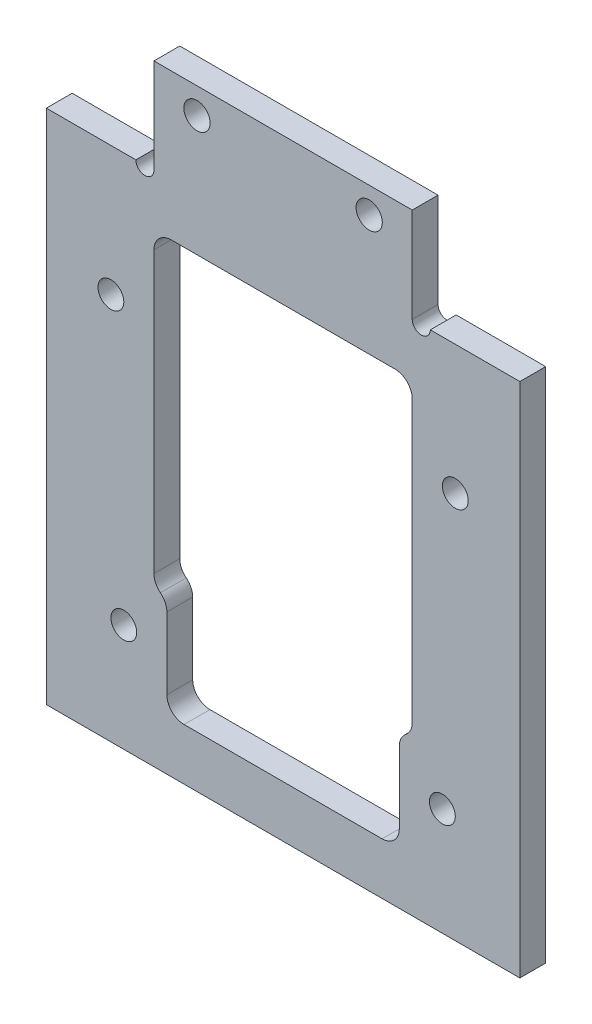
ISO-10303-21;
HEADER;
FILE_DESCRIPTION(('STEP AP214'),'2;1');
FILE_NAME('part.step','',(''),(''),'','','');
FILE_SCHEMA(('AUTOMOTIVE_DESIGN { 1 0 10303 214 1 1 1 1 }'));
ENDSEC;
DATA;
#1=APPLICATION_CONTEXT('core data for automotive mechanical design processes');
#2=APPLICATION_PROTOCOL_DEFINITION('international standard','automotive_design',2000,#1);
#3=PRODUCT_CONTEXT('',#1,'mechanical');
#4=PRODUCT('Part','Part','',(#3));
#5=PRODUCT_RELATED_PRODUCT_CATEGORY('part','',(#4));
#6=PRODUCT_DEFINITION_FORMATION('','',#4);
#7=PRODUCT_DEFINITION_CONTEXT('part definition',#1,'design');
#8=PRODUCT_DEFINITION('design','',#6,#7);
#9=PRODUCT_DEFINITION_SHAPE('','',#8);
#10=(LENGTH_UNIT() NAMED_UNIT(*) SI_UNIT(.MILLI.,.METRE.));
#11=(NAMED_UNIT(*) PLANE_ANGLE_UNIT() SI_UNIT($,.RADIAN.));
#12=(NAMED_UNIT(*) SI_UNIT($,.STERADIAN.) SOLID_ANGLE_UNIT());
#13=UNCERTAINTY_MEASURE_WITH_UNIT(LENGTH_MEASURE(1.E-05),#10,'distance_accuracy_value','');
#14=(GEOMETRIC_REPRESENTATION_CONTEXT(3) GLOBAL_UNCERTAINTY_ASSIGNED_CONTEXT((#13)) GLOBAL_UNIT_ASSIGNED_CONTEXT((#10,
#11,#12)) REPRESENTATION_CONTEXT('',''));
#15=CARTESIAN_POINT('',(0.,0.,0.));
#16=DIRECTION('',(0.,0.,1.));
#17=DIRECTION('',(1.,0.,0.));
#18=AXIS2_PLACEMENT_3D('',#15,#16,#17);
#19=CARTESIAN_POINT('',(-27.5,30.,3.));
#20=DIRECTION('',(0.,-1.,0.));
#21=DIRECTION('',(0.,0.,-1.));
#22=AXIS2_PLACEMENT_3D('',#19,#20,#21);
#23=PLANE('',#22);
#24=DIRECTION('',(-1.,0.,0.));
#25=VECTOR('',#24,1.);
#26=CARTESIAN_POINT('',(-27.5,30.,3.));
#27=LINE('',#26,#25);
#28=CARTESIAN_POINT('',(-17.1,30.,3.));
#29=VERTEX_POINT('',#28);
#30=CARTESIAN_POINT('',(-27.5,30.,3.));
#31=VERTEX_POINT('',#30);
#32=EDGE_CURVE('E244',#29,#31,#27,.T.);
#33=ORIENTED_EDGE('',*,*,#32,.F.);
#34=DIRECTION('',(0.,0.,-1.));
#35=VECTOR('',#34,1.);
#36=CARTESIAN_POINT('',(-17.1,30.,5.9698484809835));
#37=LINE('',#36,#35);
#38=CARTESIAN_POINT('',(-17.1,30.,0.));
#39=VERTEX_POINT('',#38);
#40=EDGE_CURVE('E227',#29,#39,#37,.T.);
#41=ORIENTED_EDGE('',*,*,#40,.T.);
#42=DIRECTION('',(-1.,0.,0.));
#43=VECTOR('',#42,1.);
#44=CARTESIAN_POINT('',(-27.5,30.,0.));
#45=LINE('',#44,#43);
#46=CARTESIAN_POINT('',(-27.5,30.,0.));
#47=VERTEX_POINT('',#46);
#48=EDGE_CURVE('E254',#39,#47,#45,.T.);
#49=ORIENTED_EDGE('',*,*,#48,.T.);
#50=DIRECTION('',(0.,0.,-1.));
#51=VECTOR('',#50,1.);
#52=CARTESIAN_POINT('',(-27.5,30.,3.));
#53=LINE('',#52,#51);
#54=EDGE_CURVE('E266',#31,#47,#53,.T.);
#55=ORIENTED_EDGE('',*,*,#54,.F.);
#56=EDGE_LOOP('',(#33,#41,#49,#55));
#57=FACE_BOUND('',#56,.T.);
#58=ADVANCED_FACE('F35',(#57),#23,.F.);
#59=CARTESIAN_POINT('',(27.5,-30.,3.));
#60=DIRECTION('',(-1.,0.,0.));
#61=DIRECTION('',(0.,0.,1.));
#62=AXIS2_PLACEMENT_3D('',#59,#60,#61);
#63=PLANE('',#62);
#64=DIRECTION('',(0.,1.,0.));
#65=VECTOR('',#64,1.);
#66=CARTESIAN_POINT('',(27.5,-30.,0.));
#67=LINE('',#66,#65);
#68=CARTESIAN_POINT('',(27.5,-30.,0.));
#69=VERTEX_POINT('',#68);
#70=CARTESIAN_POINT('',(27.5,30.,0.));
#71=VERTEX_POINT('',#70);
#72=EDGE_CURVE('E241',#69,#71,#67,.T.);
#73=ORIENTED_EDGE('',*,*,#72,.T.);
#74=DIRECTION('',(0.,0.,-1.));
#75=VECTOR('',#74,1.);
#76=CARTESIAN_POINT('',(27.5,30.,3.));
#77=LINE('',#76,#75);
#78=CARTESIAN_POINT('',(27.5,30.,3.));
#79=VERTEX_POINT('',#78);
#80=EDGE_CURVE('E269',#79,#71,#77,.T.);
#81=ORIENTED_EDGE('',*,*,#80,.F.);
#82=DIRECTION('',(0.,1.,0.));
#83=VECTOR('',#82,1.);
#84=CARTESIAN_POINT('',(27.5,-30.,3.));
#85=LINE('',#84,#83);
#86=CARTESIAN_POINT('',(27.5,-30.,3.));
#87=VERTEX_POINT('',#86);
#88=EDGE_CURVE('E242',#87,#79,#85,.T.);
#89=ORIENTED_EDGE('',*,*,#88,.F.);
#90=DIRECTION('',(0.,0.,-1.));
#91=VECTOR('',#90,1.);
#92=CARTESIAN_POINT('',(27.5,-30.,3.));
#93=LINE('',#92,#91);
#94=EDGE_CURVE('E251',#87,#69,#93,.T.);
#95=ORIENTED_EDGE('',*,*,#94,.T.);
#96=EDGE_LOOP('',(#73,#81,#89,#95));
#97=FACE_BOUND('',#96,.T.);
#98=ADVANCED_FACE('F462',(#97),#63,.F.);
#99=CARTESIAN_POINT('',(17.1,30.,0.));
#100=VERTEX_POINT('',#99);
#101=EDGE_CURVE('E255',#71,#100,#45,.T.);
#102=ORIENTED_EDGE('',*,*,#101,.T.);
#103=DIRECTION('',(0.,0.,-1.));
#104=VECTOR('',#103,1.);
#105=CARTESIAN_POINT('',(17.1,30.,5.9698484809835));
#106=LINE('',#105,#104);
#107=CARTESIAN_POINT('',(17.1,30.,3.));
#108=VERTEX_POINT('',#107);
#109=EDGE_CURVE('E215',#100,#108,#106,.F.);
#110=ORIENTED_EDGE('',*,*,#109,.T.);
#111=EDGE_CURVE('E214',#79,#108,#27,.T.);
#112=ORIENTED_EDGE('',*,*,#111,.F.);
#113=ORIENTED_EDGE('',*,*,#80,.T.);
#114=EDGE_LOOP('',(#102,#110,#112,#113));
#115=FACE_BOUND('',#114,.T.);
#116=ADVANCED_FACE('F464',(#115),#23,.F.);
#117=CARTESIAN_POINT('',(-27.5,-30.,3.));
#118=DIRECTION('',(1.,0.,0.));
#119=DIRECTION('',(0.,0.,-1.));
#120=AXIS2_PLACEMENT_3D('',#117,#118,#119);
#121=PLANE('',#120);
#122=DIRECTION('',(0.,-1.,0.));
#123=VECTOR('',#122,1.);
#124=CARTESIAN_POINT('',(-27.5,-30.,0.));
#125=LINE('',#124,#123);
#126=CARTESIAN_POINT('',(-27.5,-30.,0.));
#127=VERTEX_POINT('',#126);
#128=EDGE_CURVE('E258',#47,#127,#125,.T.);
#129=ORIENTED_EDGE('',*,*,#128,.T.);
#130=DIRECTION('',(0.,0.,-1.));
#131=VECTOR('',#130,1.);
#132=CARTESIAN_POINT('',(-27.5,-30.,3.));
#133=LINE('',#132,#131);
#134=CARTESIAN_POINT('',(-27.5,-30.,3.));
#135=VERTEX_POINT('',#134);
#136=EDGE_CURVE('E263',#135,#127,#133,.T.);
#137=ORIENTED_EDGE('',*,*,#136,.F.);
#138=DIRECTION('',(0.,-1.,0.));
#139=VECTOR('',#138,1.);
#140=CARTESIAN_POINT('',(-27.5,-30.,3.));
#141=LINE('',#140,#139);
#142=EDGE_CURVE('E247',#31,#135,#141,.T.);
#143=ORIENTED_EDGE('',*,*,#142,.F.);
#144=ORIENTED_EDGE('',*,*,#54,.T.);
#145=EDGE_LOOP('',(#129,#137,#143,#144));
#146=FACE_BOUND('',#145,.T.);
#147=ADVANCED_FACE('F435',(#146),#121,.F.);
#148=CARTESIAN_POINT('',(-27.5,-30.,3.));
#149=DIRECTION('',(0.,1.,0.));
#150=DIRECTION('',(0.,0.,1.));
#151=AXIS2_PLACEMENT_3D('',#148,#149,#150);
#152=PLANE('',#151);
#153=DIRECTION('',(1.,0.,0.));
#154=VECTOR('',#153,1.);
#155=CARTESIAN_POINT('',(-27.5,-30.,0.));
#156=LINE('',#155,#154);
#157=EDGE_CURVE('E245',#127,#69,#156,.T.);
#158=ORIENTED_EDGE('',*,*,#157,.T.);
#159=ORIENTED_EDGE('',*,*,#94,.F.);
#160=DIRECTION('',(1.,0.,0.));
#161=VECTOR('',#160,1.);
#162=CARTESIAN_POINT('',(-27.5,-30.,3.));
#163=LINE('',#162,#161);
#164=EDGE_CURVE('E249',#135,#87,#163,.T.);
#165=ORIENTED_EDGE('',*,*,#164,.F.);
#166=ORIENTED_EDGE('',*,*,#136,.T.);
#167=EDGE_LOOP('',(#158,#159,#165,#166));
#168=FACE_BOUND('',#167,.T.);
#169=ADVANCED_FACE('F439',(#168),#152,.F.);
#170=CARTESIAN_POINT('',(0.,0.,3.));
#171=DIRECTION('',(0.,0.,-1.));
#172=DIRECTION('',(-1.,0.,0.));
#173=AXIS2_PLACEMENT_3D('',#170,#171,#172);
#174=PLANE('',#173);
#175=DIRECTION('',(0.,-1.,0.));
#176=VECTOR('',#175,1.);
#177=CARTESIAN_POINT('',(-13.5,-24.,3.));
#178=LINE('',#177,#176);
#179=CARTESIAN_POINT('',(-13.5,-13.6860073260955,3.));
#180=VERTEX_POINT('',#179);
#181=CARTESIAN_POINT('',(-13.5,-22.,3.));
#182=VERTEX_POINT('',#181);
#183=EDGE_CURVE('E718',#180,#182,#178,.T.);
#184=ORIENTED_EDGE('',*,*,#183,.F.);
#185=CARTESIAN_POINT('',(-15.5,-13.6860073260955,3.));
#186=DIRECTION('',(0.,0.,-1.));
#187=DIRECTION('',(-1.,0.,0.));
#188=AXIS2_PLACEMENT_3D('',#185,#186,#187);
#189=CIRCLE('',#188,2.);
#190=CARTESIAN_POINT('',(-14.25,-12.1247578264959,3.));
#191=VERTEX_POINT('',#190);
#192=EDGE_CURVE('E355',#180,#191,#189,.F.);
#193=ORIENTED_EDGE('',*,*,#192,.T.);
#194=CARTESIAN_POINT('',(-13.0000000000001,-10.5635083268963,3.));
#195=DIRECTION('',(0.,0.,-1.));
#196=DIRECTION('',(-1.,0.,0.));
#197=AXIS2_PLACEMENT_3D('',#194,#195,#196);
#198=CIRCLE('',#197,2.);
#199=CARTESIAN_POINT('',(-15.0000000000001,-10.5635083268963,3.));
#200=VERTEX_POINT('',#199);
#201=EDGE_CURVE('E335',#191,#200,#198,.T.);
#202=ORIENTED_EDGE('',*,*,#201,.T.);
#203=DIRECTION('',(0.,-1.,0.));
#204=VECTOR('',#203,1.);
#205=CARTESIAN_POINT('',(-15.0000000000001,-12.5,3.));
#206=LINE('',#205,#204);
#207=CARTESIAN_POINT('',(-15.0000000000001,22.,3.));
#208=VERTEX_POINT('',#207);
#209=EDGE_CURVE('E726',#208,#200,#206,.T.);
#210=ORIENTED_EDGE('',*,*,#209,.F.);
#211=CARTESIAN_POINT('',(-13.0000000000001,22.,3.));
#212=DIRECTION('',(0.,0.,-1.));
#213=DIRECTION('',(-1.,0.,0.));
#214=AXIS2_PLACEMENT_3D('',#211,#212,#213);
#215=CIRCLE('',#214,2.);
#216=CARTESIAN_POINT('',(-13.0000000000001,24.,3.));
#217=VERTEX_POINT('',#216);
#218=EDGE_CURVE('E322',#208,#217,#215,.T.);
#219=ORIENTED_EDGE('',*,*,#218,.T.);
#220=DIRECTION('',(-1.,0.,0.));
#221=VECTOR('',#220,1.);
#222=CARTESIAN_POINT('',(-15.0000000000001,24.,3.));
#223=LINE('',#222,#221);
#224=CARTESIAN_POINT('',(12.9999999999999,24.,3.));
#225=VERTEX_POINT('',#224);
#226=EDGE_CURVE('E377',#225,#217,#223,.T.);
#227=ORIENTED_EDGE('',*,*,#226,.F.);
#228=CARTESIAN_POINT('',(12.9999999999999,22.,3.));
#229=DIRECTION('',(0.,0.,-1.));
#230=DIRECTION('',(-1.,0.,0.));
#231=AXIS2_PLACEMENT_3D('',#228,#229,#230);
#232=CIRCLE('',#231,2.);
#233=CARTESIAN_POINT('',(14.9999999999999,22.,3.));
#234=VERTEX_POINT('',#233);
#235=EDGE_CURVE('E326',#225,#234,#232,.T.);
#236=ORIENTED_EDGE('',*,*,#235,.T.);
#237=DIRECTION('',(0.,1.,0.));
#238=VECTOR('',#237,1.);
#239=CARTESIAN_POINT('',(14.9999999999999,24.,3.));
#240=LINE('',#239,#238);
#241=CARTESIAN_POINT('',(14.9999999999999,-10.5635083268963,3.));
#242=VERTEX_POINT('',#241);
#243=EDGE_CURVE('E373',#242,#234,#240,.T.);
#244=ORIENTED_EDGE('',*,*,#243,.F.);
#245=CARTESIAN_POINT('',(12.9999999999999,-10.5635083268963,3.));
#246=DIRECTION('',(0.,0.,-1.));
#247=DIRECTION('',(-1.,0.,0.));
#248=AXIS2_PLACEMENT_3D('',#245,#246,#247);
#249=CIRCLE('',#248,2.);
#250=CARTESIAN_POINT('',(14.25,-12.1247578264959,3.));
#251=VERTEX_POINT('',#250);
#252=EDGE_CURVE('E330',#242,#251,#249,.T.);
#253=ORIENTED_EDGE('',*,*,#252,.T.);
#254=CARTESIAN_POINT('',(15.5,-13.6860073260955,3.));
#255=DIRECTION('',(0.,0.,-1.));
#256=DIRECTION('',(-1.,0.,0.));
#257=AXIS2_PLACEMENT_3D('',#254,#255,#256);
#258=CIRCLE('',#257,2.);
#259=CARTESIAN_POINT('',(13.5,-13.6860073260955,3.));
#260=VERTEX_POINT('',#259);
#261=EDGE_CURVE('E353',#251,#260,#258,.F.);
#262=ORIENTED_EDGE('',*,*,#261,.T.);
#263=DIRECTION('',(0.,1.,0.));
#264=VECTOR('',#263,1.);
#265=CARTESIAN_POINT('',(13.5,-12.5,3.));
#266=LINE('',#265,#264);
#267=CARTESIAN_POINT('',(13.5,-22.,3.));
#268=VERTEX_POINT('',#267);
#269=EDGE_CURVE('E378',#268,#260,#266,.T.);
#270=ORIENTED_EDGE('',*,*,#269,.F.);
#271=CARTESIAN_POINT('',(11.5,-22.,3.));
#272=DIRECTION('',(0.,0.,-1.));
#273=DIRECTION('',(-1.,0.,0.));
#274=AXIS2_PLACEMENT_3D('',#271,#272,#273);
#275=CIRCLE('',#274,2.);
#276=CARTESIAN_POINT('',(11.5,-24.,3.));
#277=VERTEX_POINT('',#276);
#278=EDGE_CURVE('E345',#268,#277,#275,.T.);
#279=ORIENTED_EDGE('',*,*,#278,.T.);
#280=DIRECTION('',(1.,0.,0.));
#281=VECTOR('',#280,1.);
#282=CARTESIAN_POINT('',(13.5,-24.,3.));
#283=LINE('',#282,#281);
#284=CARTESIAN_POINT('',(-11.5,-24.,3.));
#285=VERTEX_POINT('',#284);
#286=EDGE_CURVE('E383',#285,#277,#283,.T.);
#287=ORIENTED_EDGE('',*,*,#286,.F.);
#288=CARTESIAN_POINT('',(-11.5,-22.,3.));
#289=DIRECTION('',(0.,0.,-1.));
#290=DIRECTION('',(-1.,0.,0.));
#291=AXIS2_PLACEMENT_3D('',#288,#289,#290);
#292=CIRCLE('',#291,2.);
#293=EDGE_CURVE('E340',#285,#182,#292,.T.);
#294=ORIENTED_EDGE('',*,*,#293,.T.);
#295=EDGE_LOOP('',(#184,#193,#202,#210,#219,#227,#236,#244,#253,#262,#270,#279,#287,#294));
#296=FACE_BOUND('',#295,.T.);
#297=CARTESIAN_POINT('',(19.9999999999999,15.,3.));
#298=DIRECTION('',(0.,0.,1.));
#299=DIRECTION('',(1.,0.,0.));
#300=AXIS2_PLACEMENT_3D('',#297,#298,#299);
#301=CIRCLE('',#300,1.5);
#302=CARTESIAN_POINT('',(21.4999999999999,15.,3.));
#303=VERTEX_POINT('',#302);
#304=EDGE_CURVE('E277',#303,#303,#301,.T.);
#305=ORIENTED_EDGE('',*,*,#304,.F.);
#306=EDGE_LOOP('',(#305));
#307=FACE_BOUND('',#306,.T.);
#308=CARTESIAN_POINT('',(-20.0000000000001,15.,3.));
#309=DIRECTION('',(0.,0.,1.));
#310=DIRECTION('',(1.,0.,0.));
#311=AXIS2_PLACEMENT_3D('',#308,#309,#310);
#312=CIRCLE('',#311,1.5);
#313=CARTESIAN_POINT('',(-18.5000000000001,15.,3.));
#314=VERTEX_POINT('',#313);
#315=EDGE_CURVE('E381',#314,#314,#312,.T.);
#316=ORIENTED_EDGE('',*,*,#315,.F.);
#317=EDGE_LOOP('',(#316));
#318=FACE_BOUND('',#317,.T.);
#319=CARTESIAN_POINT('',(18.5,-17.5,3.));
#320=DIRECTION('',(0.,0.,-1.));
#321=DIRECTION('',(-1.,0.,0.));
#322=AXIS2_PLACEMENT_3D('',#319,#320,#321);
#323=CIRCLE('',#322,1.5);
#324=CARTESIAN_POINT('',(17.,-17.5,3.));
#325=VERTEX_POINT('',#324);
#326=EDGE_CURVE('E399',#325,#325,#323,.T.);
#327=ORIENTED_EDGE('',*,*,#326,.T.);
#328=EDGE_LOOP('',(#327));
#329=FACE_BOUND('',#328,.T.);
#330=CARTESIAN_POINT('',(-18.5,-17.5,3.));
#331=DIRECTION('',(0.,0.,-1.));
#332=DIRECTION('',(-1.,0.,0.));
#333=AXIS2_PLACEMENT_3D('',#330,#331,#332);
#334=CIRCLE('',#333,1.5);
#335=CARTESIAN_POINT('',(-20.,-17.5,3.));
#336=VERTEX_POINT('',#335);
#337=EDGE_CURVE('E394',#336,#336,#334,.T.);
#338=ORIENTED_EDGE('',*,*,#337,.T.);
#339=EDGE_LOOP('',(#338));
#340=FACE_BOUND('',#339,.T.);
#341=CARTESIAN_POINT('',(-10.,38.,3.));
#342=DIRECTION('',(0.,0.,1.));
#343=DIRECTION('',(1.,0.,0.));
#344=AXIS2_PLACEMENT_3D('',#341,#342,#343);
#345=CIRCLE('',#344,1.525);
#346=CARTESIAN_POINT('',(-8.475,38.,3.));
#347=VERTEX_POINT('',#346);
#348=EDGE_CURVE('E403',#347,#347,#345,.T.);
#349=ORIENTED_EDGE('',*,*,#348,.F.);
#350=EDGE_LOOP('',(#349));
#351=FACE_BOUND('',#350,.T.);
#352=CARTESIAN_POINT('',(10.,38.,3.));
#353=DIRECTION('',(0.,0.,1.));
#354=DIRECTION('',(1.,0.,0.));
#355=AXIS2_PLACEMENT_3D('',#352,#353,#354);
#356=CIRCLE('',#355,1.525);
#357=CARTESIAN_POINT('',(11.525,38.,3.));
#358=VERTEX_POINT('',#357);
#359=EDGE_CURVE('E402',#358,#358,#356,.T.);
#360=ORIENTED_EDGE('',*,*,#359,.F.);
#361=EDGE_LOOP('',(#360));
#362=FACE_BOUND('',#361,.T.);
#363=ORIENTED_EDGE('',*,*,#111,.T.);
#364=CARTESIAN_POINT('',(16.05,30.,3.));
#365=DIRECTION('',(0.,0.,-1.));
#366=DIRECTION('',(-1.,0.,0.));
#367=AXIS2_PLACEMENT_3D('',#364,#365,#366);
#368=CIRCLE('',#367,1.05);
#369=CARTESIAN_POINT('',(15.,30.,3.));
#370=VERTEX_POINT('',#369);
#371=EDGE_CURVE('E197',#370,#108,#368,.F.);
#372=ORIENTED_EDGE('',*,*,#371,.F.);
#373=DIRECTION('',(0.,1.,0.));
#374=VECTOR('',#373,1.);
#375=CARTESIAN_POINT('',(15.,19.,3.));
#376=LINE('',#375,#374);
#377=CARTESIAN_POINT('',(15.,41.,3.));
#378=VERTEX_POINT('',#377);
#379=EDGE_CURVE('E211',#370,#378,#376,.T.);
#380=ORIENTED_EDGE('',*,*,#379,.T.);
#381=DIRECTION('',(-1.,0.,0.));
#382=VECTOR('',#381,1.);
#383=CARTESIAN_POINT('',(15.,41.,3.));
#384=LINE('',#383,#382);
#385=CARTESIAN_POINT('',(-15.,41.,3.));
#386=VERTEX_POINT('',#385);
#387=EDGE_CURVE('E206',#378,#386,#384,.T.);
#388=ORIENTED_EDGE('',*,*,#387,.T.);
#389=DIRECTION('',(0.,-1.,0.));
#390=VECTOR('',#389,1.);
#391=CARTESIAN_POINT('',(-15.,19.,3.));
#392=LINE('',#391,#390);
#393=CARTESIAN_POINT('',(-15.,30.,3.));
#394=VERTEX_POINT('',#393);
#395=EDGE_CURVE('E220',#386,#394,#392,.T.);
#396=ORIENTED_EDGE('',*,*,#395,.T.);
#397=CARTESIAN_POINT('',(-16.05,30.,3.));
#398=DIRECTION('',(0.,0.,-1.));
#399=DIRECTION('',(-1.,0.,0.));
#400=AXIS2_PLACEMENT_3D('',#397,#398,#399);
#401=CIRCLE('',#400,1.05);
#402=EDGE_CURVE('E415',#29,#394,#401,.F.);
#403=ORIENTED_EDGE('',*,*,#402,.F.);
#404=ORIENTED_EDGE('',*,*,#32,.T.);
#405=ORIENTED_EDGE('',*,*,#142,.T.);
#406=ORIENTED_EDGE('',*,*,#164,.T.);
#407=ORIENTED_EDGE('',*,*,#88,.T.);
#408=EDGE_LOOP('',(#363,#372,#380,#388,#396,#403,#404,#405,#406,#407));
#409=FACE_BOUND('',#408,.T.);
#410=ADVANCED_FACE('F210',(#296,#307,#318,#329,#340,#351,#362,#409),#174,.F.);
#411=CARTESIAN_POINT('',(0.,0.,0.));
#412=DIRECTION('',(0.,0.,-1.));
#413=DIRECTION('',(-1.,0.,0.));
#414=AXIS2_PLACEMENT_3D('',#411,#412,#413);
#415=PLANE('',#414);
#416=CARTESIAN_POINT('',(-13.0000000000001,-10.5635083268963,0.));
#417=DIRECTION('',(0.,0.,-1.));
#418=DIRECTION('',(-1.,0.,0.));
#419=AXIS2_PLACEMENT_3D('',#416,#417,#418);
#420=CIRCLE('',#419,2.);
#421=CARTESIAN_POINT('',(-15.0000000000001,-10.5635083268963,0.));
#422=VERTEX_POINT('',#421);
#423=CARTESIAN_POINT('',(-14.25,-12.1247578264959,0.));
#424=VERTEX_POINT('',#423);
#425=EDGE_CURVE('E337',#422,#424,#420,.F.);
#426=ORIENTED_EDGE('',*,*,#425,.T.);
#427=CARTESIAN_POINT('',(-15.5,-13.6860073260955,0.));
#428=DIRECTION('',(0.,0.,-1.));
#429=DIRECTION('',(-1.,0.,0.));
#430=AXIS2_PLACEMENT_3D('',#427,#428,#429);
#431=CIRCLE('',#430,2.);
#432=CARTESIAN_POINT('',(-13.5,-13.6860073260955,0.));
#433=VERTEX_POINT('',#432);
#434=EDGE_CURVE('E360',#424,#433,#431,.T.);
#435=ORIENTED_EDGE('',*,*,#434,.T.);
#436=DIRECTION('',(0.,1.,0.));
#437=VECTOR('',#436,1.);
#438=CARTESIAN_POINT('',(-13.5,0.,0.));
#439=LINE('',#438,#437);
#440=CARTESIAN_POINT('',(-13.5,-22.,0.));
#441=VERTEX_POINT('',#440);
#442=EDGE_CURVE('E272',#441,#433,#439,.T.);
#443=ORIENTED_EDGE('',*,*,#442,.F.);
#444=CARTESIAN_POINT('',(-11.5,-22.,0.));
#445=DIRECTION('',(0.,0.,-1.));
#446=DIRECTION('',(-1.,0.,0.));
#447=AXIS2_PLACEMENT_3D('',#444,#445,#446);
#448=CIRCLE('',#447,2.);
#449=CARTESIAN_POINT('',(-11.5,-24.,0.));
#450=VERTEX_POINT('',#449);
#451=EDGE_CURVE('E343',#441,#450,#448,.F.);
#452=ORIENTED_EDGE('',*,*,#451,.T.);
#453=DIRECTION('',(-1.,0.,0.));
#454=VECTOR('',#453,1.);
#455=CARTESIAN_POINT('',(0.,-24.,0.));
#456=LINE('',#455,#454);
#457=CARTESIAN_POINT('',(11.5,-24.,0.));
#458=VERTEX_POINT('',#457);
#459=EDGE_CURVE('E283',#458,#450,#456,.T.);
#460=ORIENTED_EDGE('',*,*,#459,.F.);
#461=CARTESIAN_POINT('',(11.5,-22.,0.));
#462=DIRECTION('',(0.,0.,-1.));
#463=DIRECTION('',(-1.,0.,0.));
#464=AXIS2_PLACEMENT_3D('',#461,#462,#463);
#465=CIRCLE('',#464,2.);
#466=CARTESIAN_POINT('',(13.5,-22.,0.));
#467=VERTEX_POINT('',#466);
#468=EDGE_CURVE('E347',#458,#467,#465,.F.);
#469=ORIENTED_EDGE('',*,*,#468,.T.);
#470=DIRECTION('',(0.,-1.,0.));
#471=VECTOR('',#470,1.);
#472=CARTESIAN_POINT('',(13.5,0.,0.));
#473=LINE('',#472,#471);
#474=CARTESIAN_POINT('',(13.5,-13.6860073260955,0.));
#475=VERTEX_POINT('',#474);
#476=EDGE_CURVE('E286',#475,#467,#473,.T.);
#477=ORIENTED_EDGE('',*,*,#476,.F.);
#478=CARTESIAN_POINT('',(15.5,-13.6860073260955,0.));
#479=DIRECTION('',(0.,0.,-1.));
#480=DIRECTION('',(-1.,0.,0.));
#481=AXIS2_PLACEMENT_3D('',#478,#479,#480);
#482=CIRCLE('',#481,2.);
#483=CARTESIAN_POINT('',(14.25,-12.1247578264959,0.));
#484=VERTEX_POINT('',#483);
#485=EDGE_CURVE('E50',#475,#484,#482,.T.);
#486=ORIENTED_EDGE('',*,*,#485,.T.);
#487=CARTESIAN_POINT('',(12.9999999999999,-10.5635083268963,0.));
#488=DIRECTION('',(0.,0.,-1.));
#489=DIRECTION('',(-1.,0.,0.));
#490=AXIS2_PLACEMENT_3D('',#487,#488,#489);
#491=CIRCLE('',#490,2.);
#492=CARTESIAN_POINT('',(14.9999999999999,-10.5635083268963,0.));
#493=VERTEX_POINT('',#492);
#494=EDGE_CURVE('E333',#484,#493,#491,.F.);
#495=ORIENTED_EDGE('',*,*,#494,.T.);
#496=DIRECTION('',(0.,-1.,0.));
#497=VECTOR('',#496,1.);
#498=CARTESIAN_POINT('',(14.9999999999999,0.,0.));
#499=LINE('',#498,#497);
#500=CARTESIAN_POINT('',(14.9999999999999,22.,0.));
#501=VERTEX_POINT('',#500);
#502=EDGE_CURVE('E288',#501,#493,#499,.T.);
#503=ORIENTED_EDGE('',*,*,#502,.F.);
#504=CARTESIAN_POINT('',(12.9999999999999,22.,0.));
#505=DIRECTION('',(0.,0.,-1.));
#506=DIRECTION('',(-1.,0.,0.));
#507=AXIS2_PLACEMENT_3D('',#504,#505,#506);
#508=CIRCLE('',#507,2.);
#509=CARTESIAN_POINT('',(12.9999999999999,24.,0.));
#510=VERTEX_POINT('',#509);
#511=EDGE_CURVE('E328',#501,#510,#508,.F.);
#512=ORIENTED_EDGE('',*,*,#511,.T.);
#513=DIRECTION('',(1.,0.,0.));
#514=VECTOR('',#513,1.);
#515=CARTESIAN_POINT('',(0.,24.,0.));
#516=LINE('',#515,#514);
#517=CARTESIAN_POINT('',(-13.0000000000001,24.,0.));
#518=VERTEX_POINT('',#517);
#519=EDGE_CURVE('E291',#518,#510,#516,.T.);
#520=ORIENTED_EDGE('',*,*,#519,.F.);
#521=CARTESIAN_POINT('',(-13.0000000000001,22.,0.));
#522=DIRECTION('',(0.,0.,-1.));
#523=DIRECTION('',(-1.,0.,0.));
#524=AXIS2_PLACEMENT_3D('',#521,#522,#523);
#525=CIRCLE('',#524,2.);
#526=CARTESIAN_POINT('',(-15.0000000000001,22.,0.));
#527=VERTEX_POINT('',#526);
#528=EDGE_CURVE('E324',#518,#527,#525,.F.);
#529=ORIENTED_EDGE('',*,*,#528,.T.);
#530=DIRECTION('',(0.,1.,0.));
#531=VECTOR('',#530,1.);
#532=CARTESIAN_POINT('',(-15.0000000000001,0.,0.));
#533=LINE('',#532,#531);
#534=EDGE_CURVE('E294',#422,#527,#533,.T.);
#535=ORIENTED_EDGE('',*,*,#534,.F.);
#536=EDGE_LOOP('',(#426,#435,#443,#452,#460,#469,#477,#486,#495,#503,#512,#520,#529,#535));
#537=FACE_BOUND('',#536,.T.);
#538=CARTESIAN_POINT('',(19.9999999999999,15.,0.));
#539=DIRECTION('',(0.,0.,-1.));
#540=DIRECTION('',(-1.,0.,0.));
#541=AXIS2_PLACEMENT_3D('',#538,#539,#540);
#542=CIRCLE('',#541,1.5);
#543=CARTESIAN_POINT('',(18.4999999999999,15.,0.));
#544=VERTEX_POINT('',#543);
#545=EDGE_CURVE('E276',#544,#544,#542,.T.);
#546=ORIENTED_EDGE('',*,*,#545,.F.);
#547=EDGE_LOOP('',(#546));
#548=FACE_BOUND('',#547,.T.);
#549=CARTESIAN_POINT('',(-20.0000000000001,15.,0.));
#550=DIRECTION('',(0.,0.,-1.));
#551=DIRECTION('',(-1.,0.,0.));
#552=AXIS2_PLACEMENT_3D('',#549,#550,#551);
#553=CIRCLE('',#552,1.5);
#554=CARTESIAN_POINT('',(-21.5000000000001,15.,0.));
#555=VERTEX_POINT('',#554);
#556=EDGE_CURVE('E273',#555,#555,#553,.T.);
#557=ORIENTED_EDGE('',*,*,#556,.F.);
#558=EDGE_LOOP('',(#557));
#559=FACE_BOUND('',#558,.T.);
#560=CARTESIAN_POINT('',(18.5,-17.5,0.));
#561=DIRECTION('',(0.,0.,-1.));
#562=DIRECTION('',(-1.,0.,0.));
#563=AXIS2_PLACEMENT_3D('',#560,#561,#562);
#564=CIRCLE('',#563,1.5);
#565=CARTESIAN_POINT('',(17.,-17.5,0.));
#566=VERTEX_POINT('',#565);
#567=EDGE_CURVE('E391',#566,#566,#564,.T.);
#568=ORIENTED_EDGE('',*,*,#567,.F.);
#569=EDGE_LOOP('',(#568));
#570=FACE_BOUND('',#569,.T.);
#571=CARTESIAN_POINT('',(-18.5,-17.5,0.));
#572=DIRECTION('',(0.,0.,-1.));
#573=DIRECTION('',(-1.,0.,0.));
#574=AXIS2_PLACEMENT_3D('',#571,#572,#573);
#575=CIRCLE('',#574,1.5);
#576=CARTESIAN_POINT('',(-20.,-17.5,0.));
#577=VERTEX_POINT('',#576);
#578=EDGE_CURVE('E280',#577,#577,#575,.T.);
#579=ORIENTED_EDGE('',*,*,#578,.F.);
#580=EDGE_LOOP('',(#579));
#581=FACE_BOUND('',#580,.T.);
#582=CARTESIAN_POINT('',(-10.,38.,0.));
#583=DIRECTION('',(0.,0.,-1.));
#584=DIRECTION('',(-1.,0.,0.));
#585=AXIS2_PLACEMENT_3D('',#582,#583,#584);
#586=CIRCLE('',#585,1.525);
#587=CARTESIAN_POINT('',(-11.525,38.,0.));
#588=VERTEX_POINT('',#587);
#589=EDGE_CURVE('E406',#588,#588,#586,.F.);
#590=ORIENTED_EDGE('',*,*,#589,.T.);
#591=EDGE_LOOP('',(#590));
#592=FACE_BOUND('',#591,.T.);
#593=CARTESIAN_POINT('',(10.,38.,0.));
#594=DIRECTION('',(0.,0.,-1.));
#595=DIRECTION('',(-1.,0.,0.));
#596=AXIS2_PLACEMENT_3D('',#593,#594,#595);
#597=CIRCLE('',#596,1.525);
#598=CARTESIAN_POINT('',(8.475,38.,0.));
#599=VERTEX_POINT('',#598);
#600=EDGE_CURVE('E407',#599,#599,#597,.F.);
#601=ORIENTED_EDGE('',*,*,#600,.T.);
#602=EDGE_LOOP('',(#601));
#603=FACE_BOUND('',#602,.T.);
#604=CARTESIAN_POINT('',(16.05,30.,0.));
#605=DIRECTION('',(0.,0.,-1.));
#606=DIRECTION('',(-1.,0.,0.));
#607=AXIS2_PLACEMENT_3D('',#604,#605,#606);
#608=CIRCLE('',#607,1.05);
#609=CARTESIAN_POINT('',(15.,30.,0.));
#610=VERTEX_POINT('',#609);
#611=EDGE_CURVE('E200',#100,#610,#608,.T.);
#612=ORIENTED_EDGE('',*,*,#611,.F.);
#613=ORIENTED_EDGE('',*,*,#101,.F.);
#614=ORIENTED_EDGE('',*,*,#72,.F.);
#615=ORIENTED_EDGE('',*,*,#157,.F.);
#616=ORIENTED_EDGE('',*,*,#128,.F.);
#617=ORIENTED_EDGE('',*,*,#48,.F.);
#618=CARTESIAN_POINT('',(-16.05,30.,0.));
#619=DIRECTION('',(0.,0.,-1.));
#620=DIRECTION('',(-1.,0.,0.));
#621=AXIS2_PLACEMENT_3D('',#618,#619,#620);
#622=CIRCLE('',#621,1.05);
#623=CARTESIAN_POINT('',(-15.,30.,0.));
#624=VERTEX_POINT('',#623);
#625=EDGE_CURVE('E410',#624,#39,#622,.T.);
#626=ORIENTED_EDGE('',*,*,#625,.F.);
#627=DIRECTION('',(0.,1.,0.));
#628=VECTOR('',#627,1.);
#629=CARTESIAN_POINT('',(-15.,19.,0.));
#630=LINE('',#629,#628);
#631=CARTESIAN_POINT('',(-15.,41.,0.));
#632=VERTEX_POINT('',#631);
#633=EDGE_CURVE('E230',#624,#632,#630,.T.);
#634=ORIENTED_EDGE('',*,*,#633,.T.);
#635=DIRECTION('',(1.,0.,0.));
#636=VECTOR('',#635,1.);
#637=CARTESIAN_POINT('',(15.,41.,0.));
#638=LINE('',#637,#636);
#639=CARTESIAN_POINT('',(15.,41.,0.));
#640=VERTEX_POINT('',#639);
#641=EDGE_CURVE('E232',#632,#640,#638,.T.);
#642=ORIENTED_EDGE('',*,*,#641,.T.);
#643=DIRECTION('',(0.,-1.,0.));
#644=VECTOR('',#643,1.);
#645=CARTESIAN_POINT('',(15.,19.,0.));
#646=LINE('',#645,#644);
#647=EDGE_CURVE('E235',#640,#610,#646,.T.);
#648=ORIENTED_EDGE('',*,*,#647,.T.);
#649=EDGE_LOOP('',(#612,#613,#614,#615,#616,#617,#626,#634,#642,#648));
#650=FACE_BOUND('',#649,.T.);
#651=ADVANCED_FACE('F429',(#537,#548,#559,#570,#581,#592,#603,#650),#415,.T.);
#652=CARTESIAN_POINT('',(-15.,19.,40.2021504754766));
#653=DIRECTION('',(-1.,0.,0.));
#654=DIRECTION('',(0.,0.,1.));
#655=AXIS2_PLACEMENT_3D('',#652,#653,#654);
#656=PLANE('',#655);
#657=DIRECTION('',(0.,0.,-1.));
#658=VECTOR('',#657,1.);
#659=CARTESIAN_POINT('',(-15.,30.,3.));
#660=LINE('',#659,#658);
#661=EDGE_CURVE('E205',#394,#624,#660,.T.);
#662=ORIENTED_EDGE('',*,*,#661,.F.);
#663=ORIENTED_EDGE('',*,*,#395,.F.);
#664=DIRECTION('',(0.,0.,-1.));
#665=VECTOR('',#664,1.);
#666=CARTESIAN_POINT('',(-15.,41.,40.2021504754766));
#667=LINE('',#666,#665);
#668=EDGE_CURVE('E224',#386,#632,#667,.T.);
#669=ORIENTED_EDGE('',*,*,#668,.T.);
#670=ORIENTED_EDGE('',*,*,#633,.F.);
#671=EDGE_LOOP('',(#662,#663,#669,#670));
#672=FACE_BOUND('',#671,.T.);
#673=ADVANCED_FACE('F447',(#672),#656,.T.);
#674=CARTESIAN_POINT('',(15.,19.,40.2021504754766));
#675=DIRECTION('',(1.,0.,0.));
#676=DIRECTION('',(0.,1.,0.));
#677=AXIS2_PLACEMENT_3D('',#674,#675,#676);
#678=PLANE('',#677);
#679=DIRECTION('',(0.,0.,1.));
#680=VECTOR('',#679,1.);
#681=CARTESIAN_POINT('',(15.,30.,3.));
#682=LINE('',#681,#680);
#683=EDGE_CURVE('E194',#610,#370,#682,.T.);
#684=ORIENTED_EDGE('',*,*,#683,.F.);
#685=ORIENTED_EDGE('',*,*,#647,.F.);
#686=DIRECTION('',(0.,0.,-1.));
#687=VECTOR('',#686,1.);
#688=CARTESIAN_POINT('',(15.,41.,40.2021504754766));
#689=LINE('',#688,#687);
#690=EDGE_CURVE('E218',#378,#640,#689,.T.);
#691=ORIENTED_EDGE('',*,*,#690,.F.);
#692=ORIENTED_EDGE('',*,*,#379,.F.);
#693=EDGE_LOOP('',(#684,#685,#691,#692));
#694=FACE_BOUND('',#693,.T.);
#695=ADVANCED_FACE('F217',(#694),#678,.T.);
#696=CARTESIAN_POINT('',(15.,41.,40.2021504754766));
#697=DIRECTION('',(0.,1.,0.));
#698=DIRECTION('',(-1.,0.,0.));
#699=AXIS2_PLACEMENT_3D('',#696,#697,#698);
#700=PLANE('',#699);
#701=ORIENTED_EDGE('',*,*,#387,.F.);
#702=ORIENTED_EDGE('',*,*,#690,.T.);
#703=ORIENTED_EDGE('',*,*,#641,.F.);
#704=ORIENTED_EDGE('',*,*,#668,.F.);
#705=EDGE_LOOP('',(#701,#702,#703,#704));
#706=FACE_BOUND('',#705,.T.);
#707=ADVANCED_FACE('F451',(#706),#700,.T.);
#708=CARTESIAN_POINT('',(16.05,30.,5.9698484809835));
#709=DIRECTION('',(0.,0.,-1.));
#710=DIRECTION('',(-1.,0.,0.));
#711=AXIS2_PLACEMENT_3D('',#708,#709,#710);
#712=CYLINDRICAL_SURFACE('',#711,1.05);
#713=ORIENTED_EDGE('',*,*,#611,.T.);
#714=ORIENTED_EDGE('',*,*,#683,.T.);
#715=ORIENTED_EDGE('',*,*,#371,.T.);
#716=ORIENTED_EDGE('',*,*,#109,.F.);
#717=EDGE_LOOP('',(#713,#714,#715,#716));
#718=FACE_BOUND('',#717,.T.);
#719=ADVANCED_FACE('F196',(#718),#712,.F.);
#720=CARTESIAN_POINT('',(-16.05,30.,5.9698484809835));
#721=DIRECTION('',(0.,0.,-1.));
#722=DIRECTION('',(-1.,0.,0.));
#723=AXIS2_PLACEMENT_3D('',#720,#721,#722);
#724=CYLINDRICAL_SURFACE('',#723,1.05);
#725=ORIENTED_EDGE('',*,*,#402,.T.);
#726=ORIENTED_EDGE('',*,*,#661,.T.);
#727=ORIENTED_EDGE('',*,*,#625,.T.);
#728=ORIENTED_EDGE('',*,*,#40,.F.);
#729=EDGE_LOOP('',(#725,#726,#727,#728));
#730=FACE_BOUND('',#729,.T.);
#731=ADVANCED_FACE('F445',(#730),#724,.F.);
#732=CARTESIAN_POINT('',(10.,38.,-4.31335136523794));
#733=DIRECTION('',(0.,0.,1.));
#734=DIRECTION('',(1.,0.,0.));
#735=AXIS2_PLACEMENT_3D('',#732,#733,#734);
#736=CYLINDRICAL_SURFACE('',#735,1.525);
#737=ORIENTED_EDGE('',*,*,#359,.T.);
#738=EDGE_LOOP('',(#737));
#739=FACE_BOUND('',#738,.T.);
#740=ORIENTED_EDGE('',*,*,#600,.F.);
#741=EDGE_LOOP('',(#740));
#742=FACE_BOUND('',#741,.T.);
#743=ADVANCED_FACE('F510',(#739,#742),#736,.F.);
#744=CARTESIAN_POINT('',(-10.,38.,-4.31335136523794));
#745=DIRECTION('',(0.,0.,1.));
#746=DIRECTION('',(1.,0.,0.));
#747=AXIS2_PLACEMENT_3D('',#744,#745,#746);
#748=CYLINDRICAL_SURFACE('',#747,1.525);
#749=ORIENTED_EDGE('',*,*,#348,.T.);
#750=EDGE_LOOP('',(#749));
#751=FACE_BOUND('',#750,.T.);
#752=ORIENTED_EDGE('',*,*,#589,.F.);
#753=EDGE_LOOP('',(#752));
#754=FACE_BOUND('',#753,.T.);
#755=ADVANCED_FACE('F519',(#751,#754),#748,.F.);
#756=CARTESIAN_POINT('',(-18.5,-17.5,10.));
#757=DIRECTION('',(0.,0.,-1.));
#758=DIRECTION('',(-1.,0.,0.));
#759=AXIS2_PLACEMENT_3D('',#756,#757,#758);
#760=CYLINDRICAL_SURFACE('',#759,1.5);
#761=ORIENTED_EDGE('',*,*,#578,.T.);
#762=EDGE_LOOP('',(#761));
#763=FACE_BOUND('',#762,.T.);
#764=ORIENTED_EDGE('',*,*,#337,.F.);
#765=EDGE_LOOP('',(#764));
#766=FACE_BOUND('',#765,.T.);
#767=ADVANCED_FACE('F529',(#763,#766),#760,.F.);
#768=CARTESIAN_POINT('',(18.5,-17.5,10.));
#769=DIRECTION('',(0.,0.,-1.));
#770=DIRECTION('',(-1.,0.,0.));
#771=AXIS2_PLACEMENT_3D('',#768,#769,#770);
#772=CYLINDRICAL_SURFACE('',#771,1.5);
#773=ORIENTED_EDGE('',*,*,#567,.T.);
#774=EDGE_LOOP('',(#773));
#775=FACE_BOUND('',#774,.T.);
#776=ORIENTED_EDGE('',*,*,#326,.F.);
#777=EDGE_LOOP('',(#776));
#778=FACE_BOUND('',#777,.T.);
#779=ADVANCED_FACE('F539',(#775,#778),#772,.F.);
#780=CARTESIAN_POINT('',(-20.0000000000001,15.,-7.));
#781=DIRECTION('',(0.,0.,1.));
#782=DIRECTION('',(1.,0.,0.));
#783=AXIS2_PLACEMENT_3D('',#780,#781,#782);
#784=CYLINDRICAL_SURFACE('',#783,1.5);
#785=ORIENTED_EDGE('',*,*,#556,.T.);
#786=EDGE_LOOP('',(#785));
#787=FACE_BOUND('',#786,.T.);
#788=ORIENTED_EDGE('',*,*,#315,.T.);
#789=EDGE_LOOP('',(#788));
#790=FACE_BOUND('',#789,.T.);
#791=ADVANCED_FACE('F549',(#787,#790),#784,.F.);
#792=CARTESIAN_POINT('',(19.9999999999999,15.,-7.));
#793=DIRECTION('',(0.,0.,1.));
#794=DIRECTION('',(1.,0.,0.));
#795=AXIS2_PLACEMENT_3D('',#792,#793,#794);
#796=CYLINDRICAL_SURFACE('',#795,1.5);
#797=ORIENTED_EDGE('',*,*,#545,.T.);
#798=EDGE_LOOP('',(#797));
#799=FACE_BOUND('',#798,.T.);
#800=ORIENTED_EDGE('',*,*,#304,.T.);
#801=EDGE_LOOP('',(#800));
#802=FACE_BOUND('',#801,.T.);
#803=ADVANCED_FACE('F559',(#799,#802),#796,.F.);
#804=CARTESIAN_POINT('',(-15.0000000000001,-12.5,-7.));
#805=DIRECTION('',(-1.,0.,0.));
#806=DIRECTION('',(0.,0.,1.));
#807=AXIS2_PLACEMENT_3D('',#804,#805,#806);
#808=PLANE('',#807);
#809=ORIENTED_EDGE('',*,*,#534,.T.);
#810=DIRECTION('',(0.,0.,1.));
#811=VECTOR('',#810,1.);
#812=CARTESIAN_POINT('',(-15.0000000000001,22.,3.));
#813=LINE('',#812,#811);
#814=EDGE_CURVE('E299',#527,#208,#813,.T.);
#815=ORIENTED_EDGE('',*,*,#814,.T.);
#816=ORIENTED_EDGE('',*,*,#209,.T.);
#817=DIRECTION('',(0.,0.,-1.));
#818=VECTOR('',#817,1.);
#819=CARTESIAN_POINT('',(-15.0000000000001,-10.5635083268963,-7.));
#820=LINE('',#819,#818);
#821=EDGE_CURVE('E297',#200,#422,#820,.T.);
#822=ORIENTED_EDGE('',*,*,#821,.T.);
#823=EDGE_LOOP('',(#809,#815,#816,#822));
#824=FACE_BOUND('',#823,.T.);
#825=ADVANCED_FACE('F569',(#824),#808,.F.);
#826=CARTESIAN_POINT('',(-15.0000000000001,24.,-7.));
#827=DIRECTION('',(0.,1.,0.));
#828=DIRECTION('',(0.,0.,1.));
#829=AXIS2_PLACEMENT_3D('',#826,#827,#828);
#830=PLANE('',#829);
#831=ORIENTED_EDGE('',*,*,#226,.T.);
#832=DIRECTION('',(0.,0.,1.));
#833=VECTOR('',#832,1.);
#834=CARTESIAN_POINT('',(-13.0000000000001,24.,0.));
#835=LINE('',#834,#833);
#836=EDGE_CURVE('E305',#217,#518,#835,.F.);
#837=ORIENTED_EDGE('',*,*,#836,.T.);
#838=ORIENTED_EDGE('',*,*,#519,.T.);
#839=DIRECTION('',(0.,0.,1.));
#840=VECTOR('',#839,1.);
#841=CARTESIAN_POINT('',(12.9999999999999,24.,3.));
#842=LINE('',#841,#840);
#843=EDGE_CURVE('E302',#510,#225,#842,.T.);
#844=ORIENTED_EDGE('',*,*,#843,.T.);
#845=EDGE_LOOP('',(#831,#837,#838,#844));
#846=FACE_BOUND('',#845,.T.);
#847=ADVANCED_FACE('F579',(#846),#830,.F.);
#848=CARTESIAN_POINT('',(14.9999999999999,24.,-7.));
#849=DIRECTION('',(1.,0.,0.));
#850=DIRECTION('',(0.,1.,0.));
#851=AXIS2_PLACEMENT_3D('',#848,#849,#850);
#852=PLANE('',#851);
#853=ORIENTED_EDGE('',*,*,#243,.T.);
#854=DIRECTION('',(0.,0.,1.));
#855=VECTOR('',#854,1.);
#856=CARTESIAN_POINT('',(14.9999999999999,22.,0.));
#857=LINE('',#856,#855);
#858=EDGE_CURVE('E310',#234,#501,#857,.F.);
#859=ORIENTED_EDGE('',*,*,#858,.T.);
#860=ORIENTED_EDGE('',*,*,#502,.T.);
#861=DIRECTION('',(0.,0.,1.));
#862=VECTOR('',#861,1.);
#863=CARTESIAN_POINT('',(14.9999999999999,-10.5635083268963,-7.));
#864=LINE('',#863,#862);
#865=EDGE_CURVE('E307',#493,#242,#864,.T.);
#866=ORIENTED_EDGE('',*,*,#865,.T.);
#867=EDGE_LOOP('',(#853,#859,#860,#866));
#868=FACE_BOUND('',#867,.T.);
#869=ADVANCED_FACE('F589',(#868),#852,.F.);
#870=CARTESIAN_POINT('',(13.5,-12.5,-7.));
#871=DIRECTION('',(1.,0.,0.));
#872=DIRECTION('',(0.,0.,-1.));
#873=AXIS2_PLACEMENT_3D('',#870,#871,#872);
#874=PLANE('',#873);
#875=ORIENTED_EDGE('',*,*,#269,.T.);
#876=DIRECTION('',(0.,0.,1.));
#877=VECTOR('',#876,1.);
#878=CARTESIAN_POINT('',(13.5,-13.6860073260955,-7.));
#879=LINE('',#878,#877);
#880=EDGE_CURVE('E11',#260,#475,#879,.F.);
#881=ORIENTED_EDGE('',*,*,#880,.T.);
#882=ORIENTED_EDGE('',*,*,#476,.T.);
#883=DIRECTION('',(0.,0.,1.));
#884=VECTOR('',#883,1.);
#885=CARTESIAN_POINT('',(13.5,-22.,3.));
#886=LINE('',#885,#884);
#887=EDGE_CURVE('E319',#467,#268,#886,.T.);
#888=ORIENTED_EDGE('',*,*,#887,.T.);
#889=EDGE_LOOP('',(#875,#881,#882,#888));
#890=FACE_BOUND('',#889,.T.);
#891=ADVANCED_FACE('F599',(#890),#874,.F.);
#892=CARTESIAN_POINT('',(13.5,-24.,-7.));
#893=DIRECTION('',(0.,-1.,0.));
#894=DIRECTION('',(0.,0.,-1.));
#895=AXIS2_PLACEMENT_3D('',#892,#893,#894);
#896=PLANE('',#895);
#897=ORIENTED_EDGE('',*,*,#459,.T.);
#898=DIRECTION('',(0.,0.,1.));
#899=VECTOR('',#898,1.);
#900=CARTESIAN_POINT('',(-11.5,-24.,3.));
#901=LINE('',#900,#899);
#902=EDGE_CURVE('E314',#450,#285,#901,.T.);
#903=ORIENTED_EDGE('',*,*,#902,.T.);
#904=ORIENTED_EDGE('',*,*,#286,.T.);
#905=DIRECTION('',(0.,0.,1.));
#906=VECTOR('',#905,1.);
#907=CARTESIAN_POINT('',(11.5,-24.,0.));
#908=LINE('',#907,#906);
#909=EDGE_CURVE('E312',#277,#458,#908,.F.);
#910=ORIENTED_EDGE('',*,*,#909,.T.);
#911=EDGE_LOOP('',(#897,#903,#904,#910));
#912=FACE_BOUND('',#911,.T.);
#913=ADVANCED_FACE('F606',(#912),#896,.F.);
#914=CARTESIAN_POINT('',(-13.5,-24.,-7.));
#915=DIRECTION('',(-1.,0.,0.));
#916=DIRECTION('',(0.,0.,1.));
#917=AXIS2_PLACEMENT_3D('',#914,#915,#916);
#918=PLANE('',#917);
#919=ORIENTED_EDGE('',*,*,#442,.T.);
#920=DIRECTION('',(0.,0.,-1.));
#921=VECTOR('',#920,1.);
#922=CARTESIAN_POINT('',(-13.5,-13.6860073260955,-7.));
#923=LINE('',#922,#921);
#924=EDGE_CURVE('E350',#433,#180,#923,.F.);
#925=ORIENTED_EDGE('',*,*,#924,.T.);
#926=ORIENTED_EDGE('',*,*,#183,.T.);
#927=DIRECTION('',(0.,0.,1.));
#928=VECTOR('',#927,1.);
#929=CARTESIAN_POINT('',(-13.5,-22.,0.));
#930=LINE('',#929,#928);
#931=EDGE_CURVE('E317',#182,#441,#930,.F.);
#932=ORIENTED_EDGE('',*,*,#931,.T.);
#933=EDGE_LOOP('',(#919,#925,#926,#932));
#934=FACE_BOUND('',#933,.T.);
#935=ADVANCED_FACE('F611',(#934),#918,.F.);
#936=CARTESIAN_POINT('',(-13.0000000000001,22.,-7.));
#937=DIRECTION('',(0.,0.,-1.));
#938=DIRECTION('',(-1.,0.,0.));
#939=AXIS2_PLACEMENT_3D('',#936,#937,#938);
#940=CYLINDRICAL_SURFACE('',#939,2.);
#941=ORIENTED_EDGE('',*,*,#528,.F.);
#942=ORIENTED_EDGE('',*,*,#836,.F.);
#943=ORIENTED_EDGE('',*,*,#218,.F.);
#944=ORIENTED_EDGE('',*,*,#814,.F.);
#945=EDGE_LOOP('',(#941,#942,#943,#944));
#946=FACE_BOUND('',#945,.T.);
#947=ADVANCED_FACE('F619',(#946),#940,.F.);
#948=CARTESIAN_POINT('',(12.9999999999999,22.,-7.));
#949=DIRECTION('',(0.,0.,-1.));
#950=DIRECTION('',(-1.,0.,0.));
#951=AXIS2_PLACEMENT_3D('',#948,#949,#950);
#952=CYLINDRICAL_SURFACE('',#951,2.);
#953=ORIENTED_EDGE('',*,*,#511,.F.);
#954=ORIENTED_EDGE('',*,*,#858,.F.);
#955=ORIENTED_EDGE('',*,*,#235,.F.);
#956=ORIENTED_EDGE('',*,*,#843,.F.);
#957=EDGE_LOOP('',(#953,#954,#955,#956));
#958=FACE_BOUND('',#957,.T.);
#959=ADVANCED_FACE('F624',(#958),#952,.F.);
#960=CARTESIAN_POINT('',(12.9999999999999,-10.5635083268963,-7.));
#961=DIRECTION('',(0.,0.,1.));
#962=DIRECTION('',(1.,0.,0.));
#963=AXIS2_PLACEMENT_3D('',#960,#961,#962);
#964=CYLINDRICAL_SURFACE('',#963,2.);
#965=ORIENTED_EDGE('',*,*,#494,.F.);
#966=DIRECTION('',(0.,0.,1.));
#967=VECTOR('',#966,1.);
#968=CARTESIAN_POINT('',(14.25,-12.1247578264959,-7.));
#969=LINE('',#968,#967);
#970=EDGE_CURVE('E43',#484,#251,#969,.T.);
#971=ORIENTED_EDGE('',*,*,#970,.T.);
#972=ORIENTED_EDGE('',*,*,#252,.F.);
#973=ORIENTED_EDGE('',*,*,#865,.F.);
#974=EDGE_LOOP('',(#965,#971,#972,#973));
#975=FACE_BOUND('',#974,.T.);
#976=ADVANCED_FACE('F364',(#975),#964,.F.);
#977=CARTESIAN_POINT('',(-13.0000000000001,-10.5635083268963,-7.));
#978=DIRECTION('',(0.,0.,-1.));
#979=DIRECTION('',(-1.,0.,0.));
#980=AXIS2_PLACEMENT_3D('',#977,#978,#979);
#981=CYLINDRICAL_SURFACE('',#980,2.);
#982=ORIENTED_EDGE('',*,*,#201,.F.);
#983=DIRECTION('',(0.,0.,-1.));
#984=VECTOR('',#983,1.);
#985=CARTESIAN_POINT('',(-14.25,-12.1247578264959,-7.));
#986=LINE('',#985,#984);
#987=EDGE_CURVE('E357',#191,#424,#986,.T.);
#988=ORIENTED_EDGE('',*,*,#987,.T.);
#989=ORIENTED_EDGE('',*,*,#425,.F.);
#990=ORIENTED_EDGE('',*,*,#821,.F.);
#991=EDGE_LOOP('',(#982,#988,#989,#990));
#992=FACE_BOUND('',#991,.T.);
#993=ADVANCED_FACE('F647',(#992),#981,.F.);
#994=CARTESIAN_POINT('',(-11.5,-22.,-7.));
#995=DIRECTION('',(0.,0.,-1.));
#996=DIRECTION('',(-1.,0.,0.));
#997=AXIS2_PLACEMENT_3D('',#994,#995,#996);
#998=CYLINDRICAL_SURFACE('',#997,2.);
#999=ORIENTED_EDGE('',*,*,#451,.F.);
#1000=ORIENTED_EDGE('',*,*,#931,.F.);
#1001=ORIENTED_EDGE('',*,*,#293,.F.);
#1002=ORIENTED_EDGE('',*,*,#902,.F.);
#1003=EDGE_LOOP('',(#999,#1000,#1001,#1002));
#1004=FACE_BOUND('',#1003,.T.);
#1005=ADVANCED_FACE('F641',(#1004),#998,.F.);
#1006=CARTESIAN_POINT('',(11.5,-22.,-7.));
#1007=DIRECTION('',(0.,0.,-1.));
#1008=DIRECTION('',(-1.,0.,0.));
#1009=AXIS2_PLACEMENT_3D('',#1006,#1007,#1008);
#1010=CYLINDRICAL_SURFACE('',#1009,2.);
#1011=ORIENTED_EDGE('',*,*,#468,.F.);
#1012=ORIENTED_EDGE('',*,*,#909,.F.);
#1013=ORIENTED_EDGE('',*,*,#278,.F.);
#1014=ORIENTED_EDGE('',*,*,#887,.F.);
#1015=EDGE_LOOP('',(#1011,#1012,#1013,#1014));
#1016=FACE_BOUND('',#1015,.T.);
#1017=ADVANCED_FACE('F646',(#1016),#1010,.F.);
#1018=CARTESIAN_POINT('',(-15.5,-13.6860073260955,-7.));
#1019=DIRECTION('',(0.,0.,-1.));
#1020=DIRECTION('',(-1.,0.,0.));
#1021=AXIS2_PLACEMENT_3D('',#1018,#1019,#1020);
#1022=CYLINDRICAL_SURFACE('',#1021,2.);
#1023=ORIENTED_EDGE('',*,*,#434,.F.);
#1024=ORIENTED_EDGE('',*,*,#987,.F.);
#1025=ORIENTED_EDGE('',*,*,#192,.F.);
#1026=ORIENTED_EDGE('',*,*,#924,.F.);
#1027=EDGE_LOOP('',(#1023,#1024,#1025,#1026));
#1028=FACE_BOUND('',#1027,.T.);
#1029=ADVANCED_FACE('F658',(#1028),#1022,.T.);
#1030=CARTESIAN_POINT('',(15.5,-13.6860073260955,-7.));
#1031=DIRECTION('',(0.,0.,1.));
#1032=DIRECTION('',(1.,0.,0.));
#1033=AXIS2_PLACEMENT_3D('',#1030,#1031,#1032);
#1034=CYLINDRICAL_SURFACE('',#1033,2.);
#1035=ORIENTED_EDGE('',*,*,#485,.F.);
#1036=ORIENTED_EDGE('',*,*,#880,.F.);
#1037=ORIENTED_EDGE('',*,*,#261,.F.);
#1038=ORIENTED_EDGE('',*,*,#970,.F.);
#1039=EDGE_LOOP('',(#1035,#1036,#1037,#1038));
#1040=FACE_BOUND('',#1039,.T.);
#1041=ADVANCED_FACE('F37',(#1040),#1034,.T.);
#1042=CLOSED_SHELL('',(#58,#98,#116,#147,#169,#410,#651,#673,#695,#707,#719,#731,#743,#755,#767,
#779,#791,#803,#825,#847,#869,#891,#913,#935,#947,#959,#976,#993,#1005,#1017,#1029,#1041));
#1043=MANIFOLD_SOLID_BREP('B2',#1042);
#1044=ADVANCED_BREP_SHAPE_REPRESENTATION('',(#18,#1043),#14);
#1045=SHAPE_DEFINITION_REPRESENTATION(#9,#1044);
ENDSEC;
END-ISO-10303-21;
